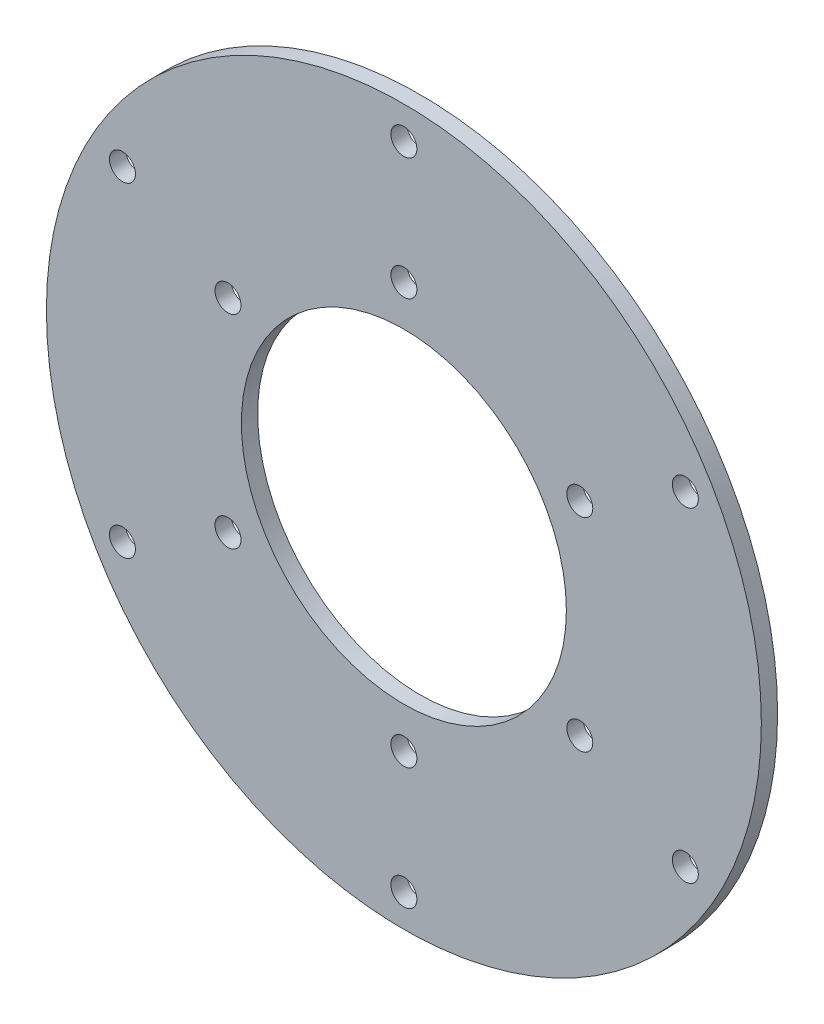
ISO-10303-21;
HEADER;
FILE_DESCRIPTION(('STEP AP214'),'2;1');
FILE_NAME('part.step','',(''),(''),'','','');
FILE_SCHEMA(('AUTOMOTIVE_DESIGN { 1 0 10303 214 1 1 1 1 }'));
ENDSEC;
DATA;
#1=APPLICATION_CONTEXT('core data for automotive mechanical design processes');
#2=APPLICATION_PROTOCOL_DEFINITION('international standard','automotive_design',2000,#1);
#3=PRODUCT_CONTEXT('',#1,'mechanical');
#4=PRODUCT('Part','Part','',(#3));
#5=PRODUCT_RELATED_PRODUCT_CATEGORY('part','',(#4));
#6=PRODUCT_DEFINITION_FORMATION('','',#4);
#7=PRODUCT_DEFINITION_CONTEXT('part definition',#1,'design');
#8=PRODUCT_DEFINITION('design','',#6,#7);
#9=PRODUCT_DEFINITION_SHAPE('','',#8);
#10=(LENGTH_UNIT() NAMED_UNIT(*) SI_UNIT(.MILLI.,.METRE.));
#11=(NAMED_UNIT(*) PLANE_ANGLE_UNIT() SI_UNIT($,.RADIAN.));
#12=(NAMED_UNIT(*) SI_UNIT($,.STERADIAN.) SOLID_ANGLE_UNIT());
#13=UNCERTAINTY_MEASURE_WITH_UNIT(LENGTH_MEASURE(1.E-05),#10,'distance_accuracy_value','');
#14=(GEOMETRIC_REPRESENTATION_CONTEXT(3) GLOBAL_UNCERTAINTY_ASSIGNED_CONTEXT((#13)) GLOBAL_UNIT_ASSIGNED_CONTEXT((#10,
#11,#12)) REPRESENTATION_CONTEXT('',''));
#15=CARTESIAN_POINT('',(0.,0.,0.));
#16=DIRECTION('',(0.,0.,1.));
#17=DIRECTION('',(1.,0.,0.));
#18=AXIS2_PLACEMENT_3D('',#15,#16,#17);
#19=CARTESIAN_POINT('',(0.,0.,2.));
#20=DIRECTION('',(0.,0.,1.));
#21=DIRECTION('',(1.,0.,0.));
#22=AXIS2_PLACEMENT_3D('',#19,#20,#21);
#23=PLANE('',#22);
#24=CARTESIAN_POINT('',(-21.650635094611,-12.5,2.));
#25=DIRECTION('',(0.,0.,1.));
#26=DIRECTION('',(1.,0.,0.));
#27=AXIS2_PLACEMENT_3D('',#24,#25,#26);
#28=CIRCLE('',#27,1.6);
#29=CARTESIAN_POINT('',(-20.050635094611,-12.5,2.));
#30=VERTEX_POINT('',#29);
#31=EDGE_CURVE('E113',#30,#30,#28,.T.);
#32=ORIENTED_EDGE('',*,*,#31,.F.);
#33=EDGE_LOOP('',(#32));
#34=FACE_BOUND('',#33,.T.);
#35=CARTESIAN_POINT('',(21.650635094611,-12.5,2.));
#36=DIRECTION('',(0.,0.,1.));
#37=DIRECTION('',(1.,0.,0.));
#38=AXIS2_PLACEMENT_3D('',#35,#36,#37);
#39=CIRCLE('',#38,1.6);
#40=CARTESIAN_POINT('',(23.250635094611,-12.5,2.));
#41=VERTEX_POINT('',#40);
#42=EDGE_CURVE('E101',#41,#41,#39,.T.);
#43=ORIENTED_EDGE('',*,*,#42,.F.);
#44=EDGE_LOOP('',(#43));
#45=FACE_BOUND('',#44,.T.);
#46=CARTESIAN_POINT('',(0.,0.,2.));
#47=DIRECTION('',(0.,0.,1.));
#48=DIRECTION('',(1.,0.,0.));
#49=AXIS2_PLACEMENT_3D('',#46,#47,#48);
#50=CIRCLE('',#49,20.);
#51=CARTESIAN_POINT('',(20.,0.,2.));
#52=VERTEX_POINT('',#51);
#53=EDGE_CURVE('E89',#52,#52,#50,.T.);
#54=ORIENTED_EDGE('',*,*,#53,.F.);
#55=EDGE_LOOP('',(#54));
#56=FACE_BOUND('',#55,.T.);
#57=CARTESIAN_POINT('',(-34.6410161513775,-20.,2.));
#58=DIRECTION('',(0.,0.,1.));
#59=DIRECTION('',(1.,0.,0.));
#60=AXIS2_PLACEMENT_3D('',#57,#58,#59);
#61=CIRCLE('',#60,1.6);
#62=CARTESIAN_POINT('',(-33.0410161513775,-20.,2.));
#63=VERTEX_POINT('',#62);
#64=EDGE_CURVE('E77',#63,#63,#61,.T.);
#65=ORIENTED_EDGE('',*,*,#64,.F.);
#66=EDGE_LOOP('',(#65));
#67=FACE_BOUND('',#66,.T.);
#68=CARTESIAN_POINT('',(34.6410161513776,-20.,2.));
#69=DIRECTION('',(0.,0.,1.));
#70=DIRECTION('',(1.,0.,0.));
#71=AXIS2_PLACEMENT_3D('',#68,#69,#70);
#72=CIRCLE('',#71,1.6);
#73=CARTESIAN_POINT('',(36.2410161513776,-20.,2.));
#74=VERTEX_POINT('',#73);
#75=EDGE_CURVE('E65',#74,#74,#72,.T.);
#76=ORIENTED_EDGE('',*,*,#75,.F.);
#77=EDGE_LOOP('',(#76));
#78=FACE_BOUND('',#77,.T.);
#79=CARTESIAN_POINT('',(0.,25.,2.));
#80=DIRECTION('',(0.,0.,1.));
#81=DIRECTION('',(1.,0.,0.));
#82=AXIS2_PLACEMENT_3D('',#79,#80,#81);
#83=CIRCLE('',#82,1.6);
#84=CARTESIAN_POINT('',(1.6,25.,2.));
#85=VERTEX_POINT('',#84);
#86=EDGE_CURVE('E53',#85,#85,#83,.T.);
#87=ORIENTED_EDGE('',*,*,#86,.F.);
#88=EDGE_LOOP('',(#87));
#89=FACE_BOUND('',#88,.T.);
#90=CARTESIAN_POINT('',(0.,0.,2.));
#91=DIRECTION('',(0.,0.,1.));
#92=DIRECTION('',(1.,0.,0.));
#93=AXIS2_PLACEMENT_3D('',#90,#91,#92);
#94=CIRCLE('',#93,44.);
#95=CARTESIAN_POINT('',(44.,0.,2.));
#96=VERTEX_POINT('',#95);
#97=EDGE_CURVE('E10',#96,#96,#94,.T.);
#98=ORIENTED_EDGE('',*,*,#97,.T.);
#99=EDGE_LOOP('',(#98));
#100=FACE_BOUND('',#99,.T.);
#101=CARTESIAN_POINT('',(0.,40.,2.));
#102=DIRECTION('',(0.,0.,1.));
#103=DIRECTION('',(1.,0.,0.));
#104=AXIS2_PLACEMENT_3D('',#101,#102,#103);
#105=CIRCLE('',#104,1.6);
#106=CARTESIAN_POINT('',(1.6,40.,2.));
#107=VERTEX_POINT('',#106);
#108=EDGE_CURVE('E48',#107,#107,#105,.T.);
#109=ORIENTED_EDGE('',*,*,#108,.F.);
#110=EDGE_LOOP('',(#109));
#111=FACE_BOUND('',#110,.T.);
#112=CARTESIAN_POINT('',(34.6410161513775,20.,2.));
#113=DIRECTION('',(0.,0.,1.));
#114=DIRECTION('',(1.,0.,0.));
#115=AXIS2_PLACEMENT_3D('',#112,#113,#114);
#116=CIRCLE('',#115,1.6);
#117=CARTESIAN_POINT('',(36.2410161513775,20.,2.));
#118=VERTEX_POINT('',#117);
#119=EDGE_CURVE('E59',#118,#118,#116,.T.);
#120=ORIENTED_EDGE('',*,*,#119,.F.);
#121=EDGE_LOOP('',(#120));
#122=FACE_BOUND('',#121,.T.);
#123=CARTESIAN_POINT('',(0.,-40.,2.));
#124=DIRECTION('',(0.,0.,1.));
#125=DIRECTION('',(1.,0.,0.));
#126=AXIS2_PLACEMENT_3D('',#123,#124,#125);
#127=CIRCLE('',#126,1.6);
#128=CARTESIAN_POINT('',(1.6,-40.,2.));
#129=VERTEX_POINT('',#128);
#130=EDGE_CURVE('E71',#129,#129,#127,.T.);
#131=ORIENTED_EDGE('',*,*,#130,.F.);
#132=EDGE_LOOP('',(#131));
#133=FACE_BOUND('',#132,.T.);
#134=CARTESIAN_POINT('',(-34.6410161513775,20.,2.));
#135=DIRECTION('',(0.,0.,1.));
#136=DIRECTION('',(1.,0.,0.));
#137=AXIS2_PLACEMENT_3D('',#134,#135,#136);
#138=CIRCLE('',#137,1.6);
#139=CARTESIAN_POINT('',(-33.0410161513775,20.,2.));
#140=VERTEX_POINT('',#139);
#141=EDGE_CURVE('E83',#140,#140,#138,.T.);
#142=ORIENTED_EDGE('',*,*,#141,.F.);
#143=EDGE_LOOP('',(#142));
#144=FACE_BOUND('',#143,.T.);
#145=CARTESIAN_POINT('',(21.650635094611,12.5,2.));
#146=DIRECTION('',(0.,0.,1.));
#147=DIRECTION('',(1.,0.,0.));
#148=AXIS2_PLACEMENT_3D('',#145,#146,#147);
#149=CIRCLE('',#148,1.6);
#150=CARTESIAN_POINT('',(23.250635094611,12.5,2.));
#151=VERTEX_POINT('',#150);
#152=EDGE_CURVE('E95',#151,#151,#149,.T.);
#153=ORIENTED_EDGE('',*,*,#152,.F.);
#154=EDGE_LOOP('',(#153));
#155=FACE_BOUND('',#154,.T.);
#156=CARTESIAN_POINT('',(0.,-25.,2.));
#157=DIRECTION('',(0.,0.,1.));
#158=DIRECTION('',(1.,0.,0.));
#159=AXIS2_PLACEMENT_3D('',#156,#157,#158);
#160=CIRCLE('',#159,1.6);
#161=CARTESIAN_POINT('',(1.6,-25.,2.));
#162=VERTEX_POINT('',#161);
#163=EDGE_CURVE('E107',#162,#162,#160,.T.);
#164=ORIENTED_EDGE('',*,*,#163,.F.);
#165=EDGE_LOOP('',(#164));
#166=FACE_BOUND('',#165,.T.);
#167=CARTESIAN_POINT('',(-21.650635094611,12.5,2.));
#168=DIRECTION('',(0.,0.,1.));
#169=DIRECTION('',(1.,0.,0.));
#170=AXIS2_PLACEMENT_3D('',#167,#168,#169);
#171=CIRCLE('',#170,1.6);
#172=CARTESIAN_POINT('',(-20.050635094611,12.5,2.));
#173=VERTEX_POINT('',#172);
#174=EDGE_CURVE('E119',#173,#173,#171,.T.);
#175=ORIENTED_EDGE('',*,*,#174,.F.);
#176=EDGE_LOOP('',(#175));
#177=FACE_BOUND('',#176,.T.);
#178=ADVANCED_FACE('F37',(#34,#45,#56,#67,#78,#89,#100,#111,#122,#133,#144,#155,#166,#177),#23,.T.);
#179=CARTESIAN_POINT('',(0.,0.,0.));
#180=DIRECTION('',(0.,0.,1.));
#181=DIRECTION('',(1.,0.,0.));
#182=AXIS2_PLACEMENT_3D('',#179,#180,#181);
#183=PLANE('',#182);
#184=CARTESIAN_POINT('',(0.,0.,0.));
#185=DIRECTION('',(0.,0.,1.));
#186=DIRECTION('',(1.,0.,0.));
#187=AXIS2_PLACEMENT_3D('',#184,#185,#186);
#188=CIRCLE('',#187,44.);
#189=CARTESIAN_POINT('',(44.,0.,0.));
#190=VERTEX_POINT('',#189);
#191=EDGE_CURVE('E41',#190,#190,#188,.T.);
#192=ORIENTED_EDGE('',*,*,#191,.F.);
#193=EDGE_LOOP('',(#192));
#194=FACE_BOUND('',#193,.T.);
#195=CARTESIAN_POINT('',(0.,40.,0.));
#196=DIRECTION('',(0.,0.,1.));
#197=DIRECTION('',(1.,0.,0.));
#198=AXIS2_PLACEMENT_3D('',#195,#196,#197);
#199=CIRCLE('',#198,1.6);
#200=CARTESIAN_POINT('',(1.6,40.,0.));
#201=VERTEX_POINT('',#200);
#202=EDGE_CURVE('E50',#201,#201,#199,.T.);
#203=ORIENTED_EDGE('',*,*,#202,.T.);
#204=EDGE_LOOP('',(#203));
#205=FACE_BOUND('',#204,.T.);
#206=CARTESIAN_POINT('',(0.,25.,0.));
#207=DIRECTION('',(0.,0.,1.));
#208=DIRECTION('',(1.,0.,0.));
#209=AXIS2_PLACEMENT_3D('',#206,#207,#208);
#210=CIRCLE('',#209,1.6);
#211=CARTESIAN_POINT('',(1.6,25.,0.));
#212=VERTEX_POINT('',#211);
#213=EDGE_CURVE('E56',#212,#212,#210,.T.);
#214=ORIENTED_EDGE('',*,*,#213,.T.);
#215=EDGE_LOOP('',(#214));
#216=FACE_BOUND('',#215,.T.);
#217=CARTESIAN_POINT('',(34.6410161513775,20.,0.));
#218=DIRECTION('',(0.,0.,1.));
#219=DIRECTION('',(1.,0.,0.));
#220=AXIS2_PLACEMENT_3D('',#217,#218,#219);
#221=CIRCLE('',#220,1.6);
#222=CARTESIAN_POINT('',(36.2410161513775,20.,0.));
#223=VERTEX_POINT('',#222);
#224=EDGE_CURVE('E62',#223,#223,#221,.T.);
#225=ORIENTED_EDGE('',*,*,#224,.T.);
#226=EDGE_LOOP('',(#225));
#227=FACE_BOUND('',#226,.T.);
#228=CARTESIAN_POINT('',(34.6410161513776,-20.,0.));
#229=DIRECTION('',(0.,0.,1.));
#230=DIRECTION('',(1.,0.,0.));
#231=AXIS2_PLACEMENT_3D('',#228,#229,#230);
#232=CIRCLE('',#231,1.6);
#233=CARTESIAN_POINT('',(36.2410161513776,-20.,0.));
#234=VERTEX_POINT('',#233);
#235=EDGE_CURVE('E68',#234,#234,#232,.T.);
#236=ORIENTED_EDGE('',*,*,#235,.T.);
#237=EDGE_LOOP('',(#236));
#238=FACE_BOUND('',#237,.T.);
#239=CARTESIAN_POINT('',(0.,-40.,0.));
#240=DIRECTION('',(0.,0.,1.));
#241=DIRECTION('',(1.,0.,0.));
#242=AXIS2_PLACEMENT_3D('',#239,#240,#241);
#243=CIRCLE('',#242,1.6);
#244=CARTESIAN_POINT('',(1.6,-40.,0.));
#245=VERTEX_POINT('',#244);
#246=EDGE_CURVE('E74',#245,#245,#243,.T.);
#247=ORIENTED_EDGE('',*,*,#246,.T.);
#248=EDGE_LOOP('',(#247));
#249=FACE_BOUND('',#248,.T.);
#250=CARTESIAN_POINT('',(-34.6410161513775,-20.,0.));
#251=DIRECTION('',(0.,0.,1.));
#252=DIRECTION('',(1.,0.,0.));
#253=AXIS2_PLACEMENT_3D('',#250,#251,#252);
#254=CIRCLE('',#253,1.6);
#255=CARTESIAN_POINT('',(-33.0410161513775,-20.,0.));
#256=VERTEX_POINT('',#255);
#257=EDGE_CURVE('E80',#256,#256,#254,.T.);
#258=ORIENTED_EDGE('',*,*,#257,.T.);
#259=EDGE_LOOP('',(#258));
#260=FACE_BOUND('',#259,.T.);
#261=CARTESIAN_POINT('',(-34.6410161513775,20.,0.));
#262=DIRECTION('',(0.,0.,1.));
#263=DIRECTION('',(1.,0.,0.));
#264=AXIS2_PLACEMENT_3D('',#261,#262,#263);
#265=CIRCLE('',#264,1.6);
#266=CARTESIAN_POINT('',(-33.0410161513775,20.,0.));
#267=VERTEX_POINT('',#266);
#268=EDGE_CURVE('E86',#267,#267,#265,.T.);
#269=ORIENTED_EDGE('',*,*,#268,.T.);
#270=EDGE_LOOP('',(#269));
#271=FACE_BOUND('',#270,.T.);
#272=CARTESIAN_POINT('',(0.,0.,0.));
#273=DIRECTION('',(0.,0.,1.));
#274=DIRECTION('',(1.,0.,0.));
#275=AXIS2_PLACEMENT_3D('',#272,#273,#274);
#276=CIRCLE('',#275,20.);
#277=CARTESIAN_POINT('',(20.,0.,0.));
#278=VERTEX_POINT('',#277);
#279=EDGE_CURVE('E92',#278,#278,#276,.T.);
#280=ORIENTED_EDGE('',*,*,#279,.T.);
#281=EDGE_LOOP('',(#280));
#282=FACE_BOUND('',#281,.T.);
#283=CARTESIAN_POINT('',(21.650635094611,12.5,0.));
#284=DIRECTION('',(0.,0.,1.));
#285=DIRECTION('',(1.,0.,0.));
#286=AXIS2_PLACEMENT_3D('',#283,#284,#285);
#287=CIRCLE('',#286,1.6);
#288=CARTESIAN_POINT('',(23.250635094611,12.5,0.));
#289=VERTEX_POINT('',#288);
#290=EDGE_CURVE('E98',#289,#289,#287,.T.);
#291=ORIENTED_EDGE('',*,*,#290,.T.);
#292=EDGE_LOOP('',(#291));
#293=FACE_BOUND('',#292,.T.);
#294=CARTESIAN_POINT('',(21.650635094611,-12.5,0.));
#295=DIRECTION('',(0.,0.,1.));
#296=DIRECTION('',(1.,0.,0.));
#297=AXIS2_PLACEMENT_3D('',#294,#295,#296);
#298=CIRCLE('',#297,1.6);
#299=CARTESIAN_POINT('',(23.250635094611,-12.5,0.));
#300=VERTEX_POINT('',#299);
#301=EDGE_CURVE('E104',#300,#300,#298,.T.);
#302=ORIENTED_EDGE('',*,*,#301,.T.);
#303=EDGE_LOOP('',(#302));
#304=FACE_BOUND('',#303,.T.);
#305=CARTESIAN_POINT('',(0.,-25.,0.));
#306=DIRECTION('',(0.,0.,1.));
#307=DIRECTION('',(1.,0.,0.));
#308=AXIS2_PLACEMENT_3D('',#305,#306,#307);
#309=CIRCLE('',#308,1.6);
#310=CARTESIAN_POINT('',(1.6,-25.,0.));
#311=VERTEX_POINT('',#310);
#312=EDGE_CURVE('E110',#311,#311,#309,.T.);
#313=ORIENTED_EDGE('',*,*,#312,.T.);
#314=EDGE_LOOP('',(#313));
#315=FACE_BOUND('',#314,.T.);
#316=CARTESIAN_POINT('',(-21.650635094611,-12.5,0.));
#317=DIRECTION('',(0.,0.,1.));
#318=DIRECTION('',(1.,0.,0.));
#319=AXIS2_PLACEMENT_3D('',#316,#317,#318);
#320=CIRCLE('',#319,1.6);
#321=CARTESIAN_POINT('',(-20.050635094611,-12.5,0.));
#322=VERTEX_POINT('',#321);
#323=EDGE_CURVE('E116',#322,#322,#320,.T.);
#324=ORIENTED_EDGE('',*,*,#323,.T.);
#325=EDGE_LOOP('',(#324));
#326=FACE_BOUND('',#325,.T.);
#327=CARTESIAN_POINT('',(-21.650635094611,12.5,0.));
#328=DIRECTION('',(0.,0.,1.));
#329=DIRECTION('',(1.,0.,0.));
#330=AXIS2_PLACEMENT_3D('',#327,#328,#329);
#331=CIRCLE('',#330,1.6);
#332=CARTESIAN_POINT('',(-20.050635094611,12.5,0.));
#333=VERTEX_POINT('',#332);
#334=EDGE_CURVE('E122',#333,#333,#331,.T.);
#335=ORIENTED_EDGE('',*,*,#334,.T.);
#336=EDGE_LOOP('',(#335));
#337=FACE_BOUND('',#336,.T.);
#338=ADVANCED_FACE('F132',(#194,#205,#216,#227,#238,#249,#260,#271,#282,#293,#304,#315,#326,
#337),#183,.F.);
#339=CARTESIAN_POINT('',(0.,0.,2.));
#340=DIRECTION('',(0.,0.,-1.));
#341=DIRECTION('',(-1.,0.,0.));
#342=AXIS2_PLACEMENT_3D('',#339,#340,#341);
#343=CYLINDRICAL_SURFACE('',#342,44.);
#344=ORIENTED_EDGE('',*,*,#97,.F.);
#345=EDGE_LOOP('',(#344));
#346=FACE_BOUND('',#345,.T.);
#347=ORIENTED_EDGE('',*,*,#191,.T.);
#348=EDGE_LOOP('',(#347));
#349=FACE_BOUND('',#348,.T.);
#350=ADVANCED_FACE('F39',(#346,#349),#343,.T.);
#351=CARTESIAN_POINT('',(0.,40.,2.));
#352=DIRECTION('',(0.,0.,-1.));
#353=DIRECTION('',(-1.,0.,0.));
#354=AXIS2_PLACEMENT_3D('',#351,#352,#353);
#355=CYLINDRICAL_SURFACE('',#354,1.6);
#356=ORIENTED_EDGE('',*,*,#108,.T.);
#357=EDGE_LOOP('',(#356));
#358=FACE_BOUND('',#357,.T.);
#359=ORIENTED_EDGE('',*,*,#202,.F.);
#360=EDGE_LOOP('',(#359));
#361=FACE_BOUND('',#360,.T.);
#362=ADVANCED_FACE('F142',(#358,#361),#355,.F.);
#363=CARTESIAN_POINT('',(0.,25.,2.));
#364=DIRECTION('',(0.,0.,-1.));
#365=DIRECTION('',(-1.,0.,0.));
#366=AXIS2_PLACEMENT_3D('',#363,#364,#365);
#367=CYLINDRICAL_SURFACE('',#366,1.6);
#368=ORIENTED_EDGE('',*,*,#86,.T.);
#369=EDGE_LOOP('',(#368));
#370=FACE_BOUND('',#369,.T.);
#371=ORIENTED_EDGE('',*,*,#213,.F.);
#372=EDGE_LOOP('',(#371));
#373=FACE_BOUND('',#372,.T.);
#374=ADVANCED_FACE('F145',(#370,#373),#367,.F.);
#375=CARTESIAN_POINT('',(34.6410161513775,20.,2.));
#376=DIRECTION('',(0.,0.,-1.));
#377=DIRECTION('',(-1.,0.,0.));
#378=AXIS2_PLACEMENT_3D('',#375,#376,#377);
#379=CYLINDRICAL_SURFACE('',#378,1.6);
#380=ORIENTED_EDGE('',*,*,#119,.T.);
#381=EDGE_LOOP('',(#380));
#382=FACE_BOUND('',#381,.T.);
#383=ORIENTED_EDGE('',*,*,#224,.F.);
#384=EDGE_LOOP('',(#383));
#385=FACE_BOUND('',#384,.T.);
#386=ADVANCED_FACE('F149',(#382,#385),#379,.F.);
#387=CARTESIAN_POINT('',(34.6410161513776,-20.,2.));
#388=DIRECTION('',(0.,0.,-1.));
#389=DIRECTION('',(-1.,0.,0.));
#390=AXIS2_PLACEMENT_3D('',#387,#388,#389);
#391=CYLINDRICAL_SURFACE('',#390,1.6);
#392=ORIENTED_EDGE('',*,*,#75,.T.);
#393=EDGE_LOOP('',(#392));
#394=FACE_BOUND('',#393,.T.);
#395=ORIENTED_EDGE('',*,*,#235,.F.);
#396=EDGE_LOOP('',(#395));
#397=FACE_BOUND('',#396,.T.);
#398=ADVANCED_FACE('F153',(#394,#397),#391,.F.);
#399=CARTESIAN_POINT('',(0.,-40.,2.));
#400=DIRECTION('',(0.,0.,-1.));
#401=DIRECTION('',(-1.,0.,0.));
#402=AXIS2_PLACEMENT_3D('',#399,#400,#401);
#403=CYLINDRICAL_SURFACE('',#402,1.6);
#404=ORIENTED_EDGE('',*,*,#130,.T.);
#405=EDGE_LOOP('',(#404));
#406=FACE_BOUND('',#405,.T.);
#407=ORIENTED_EDGE('',*,*,#246,.F.);
#408=EDGE_LOOP('',(#407));
#409=FACE_BOUND('',#408,.T.);
#410=ADVANCED_FACE('F157',(#406,#409),#403,.F.);
#411=CARTESIAN_POINT('',(-34.6410161513775,-20.,2.));
#412=DIRECTION('',(0.,0.,-1.));
#413=DIRECTION('',(-1.,0.,0.));
#414=AXIS2_PLACEMENT_3D('',#411,#412,#413);
#415=CYLINDRICAL_SURFACE('',#414,1.6);
#416=ORIENTED_EDGE('',*,*,#64,.T.);
#417=EDGE_LOOP('',(#416));
#418=FACE_BOUND('',#417,.T.);
#419=ORIENTED_EDGE('',*,*,#257,.F.);
#420=EDGE_LOOP('',(#419));
#421=FACE_BOUND('',#420,.T.);
#422=ADVANCED_FACE('F161',(#418,#421),#415,.F.);
#423=CARTESIAN_POINT('',(-34.6410161513775,20.,2.));
#424=DIRECTION('',(0.,0.,-1.));
#425=DIRECTION('',(-1.,0.,0.));
#426=AXIS2_PLACEMENT_3D('',#423,#424,#425);
#427=CYLINDRICAL_SURFACE('',#426,1.6);
#428=ORIENTED_EDGE('',*,*,#141,.T.);
#429=EDGE_LOOP('',(#428));
#430=FACE_BOUND('',#429,.T.);
#431=ORIENTED_EDGE('',*,*,#268,.F.);
#432=EDGE_LOOP('',(#431));
#433=FACE_BOUND('',#432,.T.);
#434=ADVANCED_FACE('F165',(#430,#433),#427,.F.);
#435=CARTESIAN_POINT('',(0.,0.,2.));
#436=DIRECTION('',(0.,0.,-1.));
#437=DIRECTION('',(-1.,0.,0.));
#438=AXIS2_PLACEMENT_3D('',#435,#436,#437);
#439=CYLINDRICAL_SURFACE('',#438,20.);
#440=ORIENTED_EDGE('',*,*,#53,.T.);
#441=EDGE_LOOP('',(#440));
#442=FACE_BOUND('',#441,.T.);
#443=ORIENTED_EDGE('',*,*,#279,.F.);
#444=EDGE_LOOP('',(#443));
#445=FACE_BOUND('',#444,.T.);
#446=ADVANCED_FACE('F169',(#442,#445),#439,.F.);
#447=CARTESIAN_POINT('',(21.650635094611,12.5,2.));
#448=DIRECTION('',(0.,0.,-1.));
#449=DIRECTION('',(-1.,0.,0.));
#450=AXIS2_PLACEMENT_3D('',#447,#448,#449);
#451=CYLINDRICAL_SURFACE('',#450,1.6);
#452=ORIENTED_EDGE('',*,*,#152,.T.);
#453=EDGE_LOOP('',(#452));
#454=FACE_BOUND('',#453,.T.);
#455=ORIENTED_EDGE('',*,*,#290,.F.);
#456=EDGE_LOOP('',(#455));
#457=FACE_BOUND('',#456,.T.);
#458=ADVANCED_FACE('F173',(#454,#457),#451,.F.);
#459=CARTESIAN_POINT('',(21.650635094611,-12.5,2.));
#460=DIRECTION('',(0.,0.,-1.));
#461=DIRECTION('',(-1.,0.,0.));
#462=AXIS2_PLACEMENT_3D('',#459,#460,#461);
#463=CYLINDRICAL_SURFACE('',#462,1.6);
#464=ORIENTED_EDGE('',*,*,#42,.T.);
#465=EDGE_LOOP('',(#464));
#466=FACE_BOUND('',#465,.T.);
#467=ORIENTED_EDGE('',*,*,#301,.F.);
#468=EDGE_LOOP('',(#467));
#469=FACE_BOUND('',#468,.T.);
#470=ADVANCED_FACE('F177',(#466,#469),#463,.F.);
#471=CARTESIAN_POINT('',(0.,-25.,2.));
#472=DIRECTION('',(0.,0.,-1.));
#473=DIRECTION('',(-1.,0.,0.));
#474=AXIS2_PLACEMENT_3D('',#471,#472,#473);
#475=CYLINDRICAL_SURFACE('',#474,1.6);
#476=ORIENTED_EDGE('',*,*,#163,.T.);
#477=EDGE_LOOP('',(#476));
#478=FACE_BOUND('',#477,.T.);
#479=ORIENTED_EDGE('',*,*,#312,.F.);
#480=EDGE_LOOP('',(#479));
#481=FACE_BOUND('',#480,.T.);
#482=ADVANCED_FACE('F181',(#478,#481),#475,.F.);
#483=CARTESIAN_POINT('',(-21.650635094611,-12.5,2.));
#484=DIRECTION('',(0.,0.,-1.));
#485=DIRECTION('',(-1.,0.,0.));
#486=AXIS2_PLACEMENT_3D('',#483,#484,#485);
#487=CYLINDRICAL_SURFACE('',#486,1.6);
#488=ORIENTED_EDGE('',*,*,#31,.T.);
#489=EDGE_LOOP('',(#488));
#490=FACE_BOUND('',#489,.T.);
#491=ORIENTED_EDGE('',*,*,#323,.F.);
#492=EDGE_LOOP('',(#491));
#493=FACE_BOUND('',#492,.T.);
#494=ADVANCED_FACE('F185',(#490,#493),#487,.F.);
#495=CARTESIAN_POINT('',(-21.650635094611,12.5,2.));
#496=DIRECTION('',(0.,0.,-1.));
#497=DIRECTION('',(-1.,0.,0.));
#498=AXIS2_PLACEMENT_3D('',#495,#496,#497);
#499=CYLINDRICAL_SURFACE('',#498,1.6);
#500=ORIENTED_EDGE('',*,*,#174,.T.);
#501=EDGE_LOOP('',(#500));
#502=FACE_BOUND('',#501,.T.);
#503=ORIENTED_EDGE('',*,*,#334,.F.);
#504=EDGE_LOOP('',(#503));
#505=FACE_BOUND('',#504,.T.);
#506=ADVANCED_FACE('F128',(#502,#505),#499,.F.);
#507=CLOSED_SHELL('',(#178,#338,#350,#362,#374,#386,#398,#410,#422,#434,#446,#458,#470,#482,
#494,#506));
#508=MANIFOLD_SOLID_BREP('B2',#507);
#509=ADVANCED_BREP_SHAPE_REPRESENTATION('',(#18,#508),#14);
#510=SHAPE_DEFINITION_REPRESENTATION(#9,#509);
ENDSEC;
END-ISO-10303-21;
